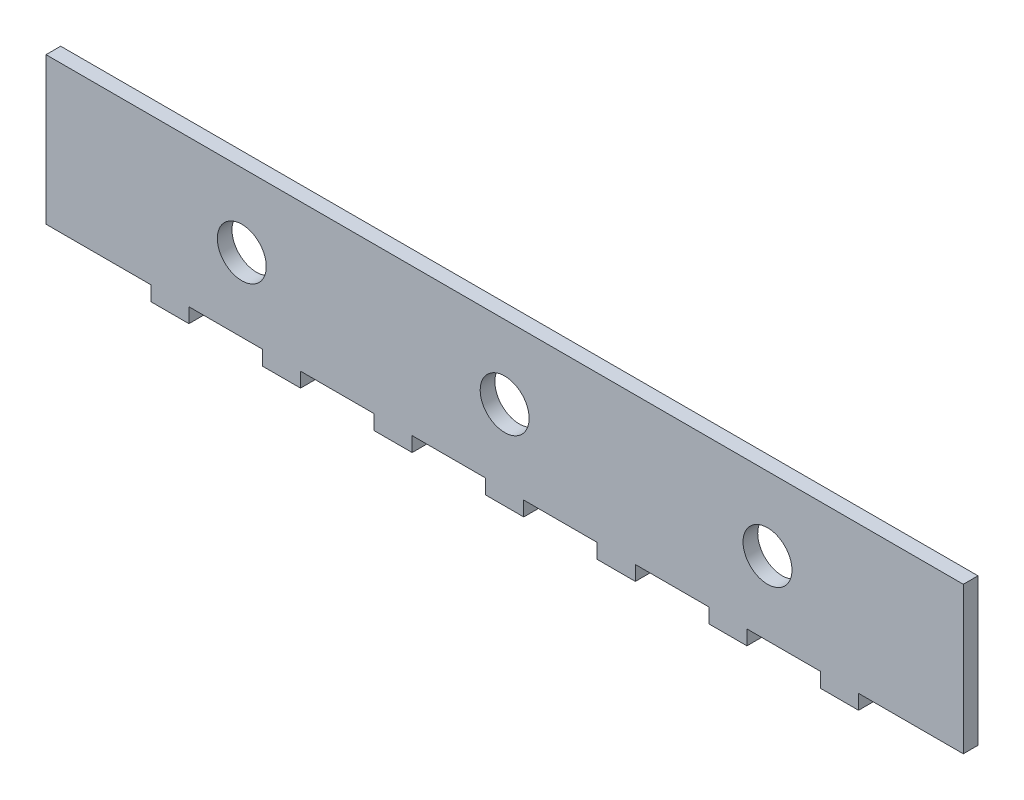
ISO-10303-21;
HEADER;
FILE_DESCRIPTION(('STEP AP214'),'2;1');
FILE_NAME('part.step','',(''),(''),'','','');
FILE_SCHEMA(('AUTOMOTIVE_DESIGN { 1 0 10303 214 1 1 1 1 }'));
ENDSEC;
DATA;
#1=APPLICATION_CONTEXT('core data for automotive mechanical design processes');
#2=APPLICATION_PROTOCOL_DEFINITION('international standard','automotive_design',2000,#1);
#3=PRODUCT_CONTEXT('',#1,'mechanical');
#4=PRODUCT('Part','Part','',(#3));
#5=PRODUCT_RELATED_PRODUCT_CATEGORY('part','',(#4));
#6=PRODUCT_DEFINITION_FORMATION('','',#4);
#7=PRODUCT_DEFINITION_CONTEXT('part definition',#1,'design');
#8=PRODUCT_DEFINITION('design','',#6,#7);
#9=PRODUCT_DEFINITION_SHAPE('','',#8);
#10=(LENGTH_UNIT() NAMED_UNIT(*) SI_UNIT(.MILLI.,.METRE.));
#11=(NAMED_UNIT(*) PLANE_ANGLE_UNIT() SI_UNIT($,.RADIAN.));
#12=(NAMED_UNIT(*) SI_UNIT($,.STERADIAN.) SOLID_ANGLE_UNIT());
#13=UNCERTAINTY_MEASURE_WITH_UNIT(LENGTH_MEASURE(1.E-05),#10,'distance_accuracy_value','');
#14=(GEOMETRIC_REPRESENTATION_CONTEXT(3) GLOBAL_UNCERTAINTY_ASSIGNED_CONTEXT((#13)) GLOBAL_UNIT_ASSIGNED_CONTEXT((#10,
#11,#12)) REPRESENTATION_CONTEXT('',''));
#15=CARTESIAN_POINT('',(0.,0.,0.));
#16=DIRECTION('',(0.,0.,1.));
#17=DIRECTION('',(1.,0.,0.));
#18=AXIS2_PLACEMENT_3D('',#15,#16,#17);
#19=CARTESIAN_POINT('',(-93.7,-15.,3.));
#20=DIRECTION('',(0.,1.,0.));
#21=DIRECTION('',(0.,0.,1.));
#22=AXIS2_PLACEMENT_3D('',#19,#20,#21);
#23=PLANE('',#22);
#24=DIRECTION('',(0.,0.,-1.));
#25=VECTOR('',#24,1.);
#26=CARTESIAN_POINT('',(64.5,-15.,3.));
#27=LINE('',#26,#25);
#28=CARTESIAN_POINT('',(64.5,-15.,3.));
#29=VERTEX_POINT('',#28);
#30=CARTESIAN_POINT('',(64.5,-15.,0.));
#31=VERTEX_POINT('',#30);
#32=EDGE_CURVE('E58',#29,#31,#27,.T.);
#33=ORIENTED_EDGE('',*,*,#32,.F.);
#34=DIRECTION('',(1.,0.,0.));
#35=VECTOR('',#34,1.);
#36=CARTESIAN_POINT('',(-93.7,-15.,3.));
#37=LINE('',#36,#35);
#38=CARTESIAN_POINT('',(49.5,-15.,3.));
#39=VERTEX_POINT('',#38);
#40=EDGE_CURVE('E483',#39,#29,#37,.T.);
#41=ORIENTED_EDGE('',*,*,#40,.F.);
#42=DIRECTION('',(0.,0.,1.));
#43=VECTOR('',#42,1.);
#44=CARTESIAN_POINT('',(49.5,-15.,3.));
#45=LINE('',#44,#43);
#46=CARTESIAN_POINT('',(49.5,-15.,0.));
#47=VERTEX_POINT('',#46);
#48=EDGE_CURVE('E271',#47,#39,#45,.T.);
#49=ORIENTED_EDGE('',*,*,#48,.F.);
#50=DIRECTION('',(1.,0.,0.));
#51=VECTOR('',#50,1.);
#52=CARTESIAN_POINT('',(-93.7,-15.,0.));
#53=LINE('',#52,#51);
#54=EDGE_CURVE('E521',#47,#31,#53,.T.);
#55=ORIENTED_EDGE('',*,*,#54,.T.);
#56=EDGE_LOOP('',(#33,#41,#49,#55));
#57=FACE_BOUND('',#56,.T.);
#58=ADVANCED_FACE('F35',(#57),#23,.F.);
#59=DIRECTION('',(0.,0.,1.));
#60=VECTOR('',#59,1.);
#61=CARTESIAN_POINT('',(72.3,-15.,3.));
#62=LINE('',#61,#60);
#63=CARTESIAN_POINT('',(72.3,-15.,0.));
#64=VERTEX_POINT('',#63);
#65=CARTESIAN_POINT('',(72.3,-15.,3.));
#66=VERTEX_POINT('',#65);
#67=EDGE_CURVE('E265',#64,#66,#62,.T.);
#68=ORIENTED_EDGE('',*,*,#67,.F.);
#69=CARTESIAN_POINT('',(93.7,-15.,0.));
#70=VERTEX_POINT('',#69);
#71=EDGE_CURVE('E451',#64,#70,#53,.T.);
#72=ORIENTED_EDGE('',*,*,#71,.T.);
#73=DIRECTION('',(0.,0.,-1.));
#74=VECTOR('',#73,1.);
#75=CARTESIAN_POINT('',(93.7,-15.,3.));
#76=LINE('',#75,#74);
#77=CARTESIAN_POINT('',(93.7,-15.,3.));
#78=VERTEX_POINT('',#77);
#79=EDGE_CURVE('E43',#78,#70,#76,.T.);
#80=ORIENTED_EDGE('',*,*,#79,.F.);
#81=EDGE_CURVE('E50',#66,#78,#37,.T.);
#82=ORIENTED_EDGE('',*,*,#81,.F.);
#83=EDGE_LOOP('',(#68,#72,#80,#82));
#84=FACE_BOUND('',#83,.T.);
#85=ADVANCED_FACE('F550',(#84),#23,.F.);
#86=DIRECTION('',(0.,0.,-1.));
#87=VECTOR('',#86,1.);
#88=CARTESIAN_POINT('',(41.7,-15.,3.));
#89=LINE('',#88,#87);
#90=CARTESIAN_POINT('',(41.7,-15.,3.));
#91=VERTEX_POINT('',#90);
#92=CARTESIAN_POINT('',(41.7,-15.,0.));
#93=VERTEX_POINT('',#92);
#94=EDGE_CURVE('E268',#91,#93,#89,.T.);
#95=ORIENTED_EDGE('',*,*,#94,.F.);
#96=CARTESIAN_POINT('',(26.7,-15.,3.));
#97=VERTEX_POINT('',#96);
#98=EDGE_CURVE('E484',#97,#91,#37,.T.);
#99=ORIENTED_EDGE('',*,*,#98,.F.);
#100=DIRECTION('',(0.,0.,1.));
#101=VECTOR('',#100,1.);
#102=CARTESIAN_POINT('',(26.7,-15.,3.));
#103=LINE('',#102,#101);
#104=CARTESIAN_POINT('',(26.7,-15.,0.));
#105=VERTEX_POINT('',#104);
#106=EDGE_CURVE('E305',#105,#97,#103,.T.);
#107=ORIENTED_EDGE('',*,*,#106,.F.);
#108=EDGE_CURVE('E519',#105,#93,#53,.T.);
#109=ORIENTED_EDGE('',*,*,#108,.T.);
#110=EDGE_LOOP('',(#95,#99,#107,#109));
#111=FACE_BOUND('',#110,.T.);
#112=ADVANCED_FACE('F555',(#111),#23,.F.);
#113=DIRECTION('',(0.,0.,-1.));
#114=VECTOR('',#113,1.);
#115=CARTESIAN_POINT('',(18.9,-15.,3.));
#116=LINE('',#115,#114);
#117=CARTESIAN_POINT('',(18.9,-15.,3.));
#118=VERTEX_POINT('',#117);
#119=CARTESIAN_POINT('',(18.9,-15.,0.));
#120=VERTEX_POINT('',#119);
#121=EDGE_CURVE('E300',#118,#120,#116,.T.);
#122=ORIENTED_EDGE('',*,*,#121,.F.);
#123=CARTESIAN_POINT('',(3.9,-15.,3.));
#124=VERTEX_POINT('',#123);
#125=EDGE_CURVE('E444',#124,#118,#37,.T.);
#126=ORIENTED_EDGE('',*,*,#125,.F.);
#127=DIRECTION('',(0.,0.,1.));
#128=VECTOR('',#127,1.);
#129=CARTESIAN_POINT('',(3.9,-15.,3.));
#130=LINE('',#129,#128);
#131=CARTESIAN_POINT('',(3.9,-15.,0.));
#132=VERTEX_POINT('',#131);
#133=EDGE_CURVE('E413',#132,#124,#130,.T.);
#134=ORIENTED_EDGE('',*,*,#133,.F.);
#135=EDGE_CURVE('E456',#132,#120,#53,.T.);
#136=ORIENTED_EDGE('',*,*,#135,.T.);
#137=EDGE_LOOP('',(#122,#126,#134,#136));
#138=FACE_BOUND('',#137,.T.);
#139=ADVANCED_FACE('F517',(#138),#23,.F.);
#140=DIRECTION('',(0.,0.,-1.));
#141=VECTOR('',#140,1.);
#142=CARTESIAN_POINT('',(-72.3,-15.,3.));
#143=LINE('',#142,#141);
#144=CARTESIAN_POINT('',(-72.3,-15.,3.));
#145=VERTEX_POINT('',#144);
#146=CARTESIAN_POINT('',(-72.3,-15.,0.));
#147=VERTEX_POINT('',#146);
#148=EDGE_CURVE('E327',#145,#147,#143,.T.);
#149=ORIENTED_EDGE('',*,*,#148,.F.);
#150=CARTESIAN_POINT('',(-93.7,-15.,3.));
#151=VERTEX_POINT('',#150);
#152=EDGE_CURVE('E439',#151,#145,#37,.T.);
#153=ORIENTED_EDGE('',*,*,#152,.F.);
#154=DIRECTION('',(0.,0.,-1.));
#155=VECTOR('',#154,1.);
#156=CARTESIAN_POINT('',(-93.7,-15.,3.));
#157=LINE('',#156,#155);
#158=CARTESIAN_POINT('',(-93.7,-15.,0.));
#159=VERTEX_POINT('',#158);
#160=EDGE_CURVE('E11',#151,#159,#157,.T.);
#161=ORIENTED_EDGE('',*,*,#160,.T.);
#162=EDGE_CURVE('E452',#159,#147,#53,.T.);
#163=ORIENTED_EDGE('',*,*,#162,.T.);
#164=EDGE_LOOP('',(#149,#153,#161,#163));
#165=FACE_BOUND('',#164,.T.);
#166=ADVANCED_FACE('F551',(#165),#23,.F.);
#167=DIRECTION('',(0.,0.,1.));
#168=VECTOR('',#167,1.);
#169=CARTESIAN_POINT('',(-64.5,-15.,3.));
#170=LINE('',#169,#168);
#171=CARTESIAN_POINT('',(-64.5,-15.,0.));
#172=VERTEX_POINT('',#171);
#173=CARTESIAN_POINT('',(-64.5,-15.,3.));
#174=VERTEX_POINT('',#173);
#175=EDGE_CURVE('E332',#172,#174,#170,.T.);
#176=ORIENTED_EDGE('',*,*,#175,.F.);
#177=CARTESIAN_POINT('',(-49.5,-15.,0.));
#178=VERTEX_POINT('',#177);
#179=EDGE_CURVE('E455',#172,#178,#53,.T.);
#180=ORIENTED_EDGE('',*,*,#179,.T.);
#181=DIRECTION('',(0.,0.,-1.));
#182=VECTOR('',#181,1.);
#183=CARTESIAN_POINT('',(-49.5,-15.,3.));
#184=LINE('',#183,#182);
#185=CARTESIAN_POINT('',(-49.5,-15.,3.));
#186=VERTEX_POINT('',#185);
#187=EDGE_CURVE('E354',#186,#178,#184,.T.);
#188=ORIENTED_EDGE('',*,*,#187,.F.);
#189=EDGE_CURVE('E443',#174,#186,#37,.T.);
#190=ORIENTED_EDGE('',*,*,#189,.F.);
#191=EDGE_LOOP('',(#176,#180,#188,#190));
#192=FACE_BOUND('',#191,.T.);
#193=ADVANCED_FACE('F558',(#192),#23,.F.);
#194=DIRECTION('',(0.,0.,1.));
#195=VECTOR('',#194,1.);
#196=CARTESIAN_POINT('',(-41.7,-15.,3.));
#197=LINE('',#196,#195);
#198=CARTESIAN_POINT('',(-41.7,-15.,0.));
#199=VERTEX_POINT('',#198);
#200=CARTESIAN_POINT('',(-41.7,-15.,3.));
#201=VERTEX_POINT('',#200);
#202=EDGE_CURVE('E359',#199,#201,#197,.T.);
#203=ORIENTED_EDGE('',*,*,#202,.F.);
#204=CARTESIAN_POINT('',(-26.7,-15.,0.));
#205=VERTEX_POINT('',#204);
#206=EDGE_CURVE('E520',#199,#205,#53,.T.);
#207=ORIENTED_EDGE('',*,*,#206,.T.);
#208=DIRECTION('',(0.,0.,-1.));
#209=VECTOR('',#208,1.);
#210=CARTESIAN_POINT('',(-26.7,-15.,3.));
#211=LINE('',#210,#209);
#212=CARTESIAN_POINT('',(-26.7,-15.,3.));
#213=VERTEX_POINT('',#212);
#214=EDGE_CURVE('E381',#213,#205,#211,.T.);
#215=ORIENTED_EDGE('',*,*,#214,.F.);
#216=EDGE_CURVE('E489',#201,#213,#37,.T.);
#217=ORIENTED_EDGE('',*,*,#216,.F.);
#218=EDGE_LOOP('',(#203,#207,#215,#217));
#219=FACE_BOUND('',#218,.T.);
#220=ADVANCED_FACE('F528',(#219),#23,.F.);
#221=DIRECTION('',(0.,0.,1.));
#222=VECTOR('',#221,1.);
#223=CARTESIAN_POINT('',(-18.9,-15.,3.));
#224=LINE('',#223,#222);
#225=CARTESIAN_POINT('',(-18.9,-15.,0.));
#226=VERTEX_POINT('',#225);
#227=CARTESIAN_POINT('',(-18.9,-15.,3.));
#228=VERTEX_POINT('',#227);
#229=EDGE_CURVE('E386',#226,#228,#224,.T.);
#230=ORIENTED_EDGE('',*,*,#229,.F.);
#231=CARTESIAN_POINT('',(-3.9,-15.,0.));
#232=VERTEX_POINT('',#231);
#233=EDGE_CURVE('E503',#226,#232,#53,.T.);
#234=ORIENTED_EDGE('',*,*,#233,.T.);
#235=DIRECTION('',(0.,0.,-1.));
#236=VECTOR('',#235,1.);
#237=CARTESIAN_POINT('',(-3.9,-15.,3.));
#238=LINE('',#237,#236);
#239=CARTESIAN_POINT('',(-3.9,-15.,3.));
#240=VERTEX_POINT('',#239);
#241=EDGE_CURVE('E408',#240,#232,#238,.T.);
#242=ORIENTED_EDGE('',*,*,#241,.F.);
#243=EDGE_CURVE('E488',#228,#240,#37,.T.);
#244=ORIENTED_EDGE('',*,*,#243,.F.);
#245=EDGE_LOOP('',(#230,#234,#242,#244));
#246=FACE_BOUND('',#245,.T.);
#247=ADVANCED_FACE('F502',(#246),#23,.F.);
#248=CARTESIAN_POINT('',(-93.7,15.,3.));
#249=DIRECTION('',(1.,0.,0.));
#250=DIRECTION('',(0.,1.,0.));
#251=AXIS2_PLACEMENT_3D('',#248,#249,#250);
#252=PLANE('',#251);
#253=DIRECTION('',(0.,-1.,0.));
#254=VECTOR('',#253,1.);
#255=CARTESIAN_POINT('',(-93.7,15.,0.));
#256=LINE('',#255,#254);
#257=CARTESIAN_POINT('',(-93.7,15.,0.));
#258=VERTEX_POINT('',#257);
#259=EDGE_CURVE('E434',#258,#159,#256,.T.);
#260=ORIENTED_EDGE('',*,*,#259,.T.);
#261=ORIENTED_EDGE('',*,*,#160,.F.);
#262=DIRECTION('',(0.,-1.,0.));
#263=VECTOR('',#262,1.);
#264=CARTESIAN_POINT('',(-93.7,15.,3.));
#265=LINE('',#264,#263);
#266=CARTESIAN_POINT('',(-93.7,15.,3.));
#267=VERTEX_POINT('',#266);
#268=EDGE_CURVE('E435',#267,#151,#265,.T.);
#269=ORIENTED_EDGE('',*,*,#268,.F.);
#270=DIRECTION('',(0.,0.,-1.));
#271=VECTOR('',#270,1.);
#272=CARTESIAN_POINT('',(-93.7,15.,3.));
#273=LINE('',#272,#271);
#274=EDGE_CURVE('E448',#267,#258,#273,.T.);
#275=ORIENTED_EDGE('',*,*,#274,.T.);
#276=EDGE_LOOP('',(#260,#261,#269,#275));
#277=FACE_BOUND('',#276,.T.);
#278=ADVANCED_FACE('F37',(#277),#252,.F.);
#279=CARTESIAN_POINT('',(93.7,15.,3.));
#280=DIRECTION('',(-1.,0.,0.));
#281=DIRECTION('',(0.,-1.,0.));
#282=AXIS2_PLACEMENT_3D('',#279,#280,#281);
#283=PLANE('',#282);
#284=DIRECTION('',(0.,1.,0.));
#285=VECTOR('',#284,1.);
#286=CARTESIAN_POINT('',(93.7,15.,0.));
#287=LINE('',#286,#285);
#288=CARTESIAN_POINT('',(93.7,15.,0.));
#289=VERTEX_POINT('',#288);
#290=EDGE_CURVE('E454',#70,#289,#287,.T.);
#291=ORIENTED_EDGE('',*,*,#290,.T.);
#292=DIRECTION('',(0.,0.,-1.));
#293=VECTOR('',#292,1.);
#294=CARTESIAN_POINT('',(93.7,15.,3.));
#295=LINE('',#294,#293);
#296=CARTESIAN_POINT('',(93.7,15.,3.));
#297=VERTEX_POINT('',#296);
#298=EDGE_CURVE('E461',#297,#289,#295,.T.);
#299=ORIENTED_EDGE('',*,*,#298,.F.);
#300=DIRECTION('',(0.,1.,0.));
#301=VECTOR('',#300,1.);
#302=CARTESIAN_POINT('',(93.7,15.,3.));
#303=LINE('',#302,#301);
#304=EDGE_CURVE('E442',#78,#297,#303,.T.);
#305=ORIENTED_EDGE('',*,*,#304,.F.);
#306=ORIENTED_EDGE('',*,*,#79,.T.);
#307=EDGE_LOOP('',(#291,#299,#305,#306));
#308=FACE_BOUND('',#307,.T.);
#309=ADVANCED_FACE('F467',(#308),#283,.F.);
#310=CARTESIAN_POINT('',(-93.7,15.,3.));
#311=DIRECTION('',(0.,-1.,0.));
#312=DIRECTION('',(0.,0.,-1.));
#313=AXIS2_PLACEMENT_3D('',#310,#311,#312);
#314=PLANE('',#313);
#315=DIRECTION('',(-1.,0.,0.));
#316=VECTOR('',#315,1.);
#317=CARTESIAN_POINT('',(-93.7,15.,0.));
#318=LINE('',#317,#316);
#319=EDGE_CURVE('E438',#289,#258,#318,.T.);
#320=ORIENTED_EDGE('',*,*,#319,.T.);
#321=ORIENTED_EDGE('',*,*,#274,.F.);
#322=DIRECTION('',(-1.,0.,0.));
#323=VECTOR('',#322,1.);
#324=CARTESIAN_POINT('',(-93.7,15.,3.));
#325=LINE('',#324,#323);
#326=EDGE_CURVE('E446',#297,#267,#325,.T.);
#327=ORIENTED_EDGE('',*,*,#326,.F.);
#328=ORIENTED_EDGE('',*,*,#298,.T.);
#329=EDGE_LOOP('',(#320,#321,#327,#328));
#330=FACE_BOUND('',#329,.T.);
#331=ADVANCED_FACE('F473',(#330),#314,.F.);
#332=CARTESIAN_POINT('',(0.,0.,3.));
#333=DIRECTION('',(0.,0.,1.));
#334=DIRECTION('',(1.,0.,0.));
#335=AXIS2_PLACEMENT_3D('',#332,#333,#334);
#336=PLANE('',#335);
#337=CARTESIAN_POINT('',(-53.7,0.,3.));
#338=DIRECTION('',(0.,0.,-1.));
#339=DIRECTION('',(-1.,0.,0.));
#340=AXIS2_PLACEMENT_3D('',#337,#338,#339);
#341=CIRCLE('',#340,5.);
#342=CARTESIAN_POINT('',(-58.7,0.,3.));
#343=VERTEX_POINT('',#342);
#344=EDGE_CURVE('E671',#343,#343,#341,.T.);
#345=ORIENTED_EDGE('',*,*,#344,.T.);
#346=EDGE_LOOP('',(#345));
#347=FACE_BOUND('',#346,.T.);
#348=CARTESIAN_POINT('',(53.7,0.,3.));
#349=DIRECTION('',(0.,0.,-1.));
#350=DIRECTION('',(-1.,0.,0.));
#351=AXIS2_PLACEMENT_3D('',#348,#349,#350);
#352=CIRCLE('',#351,5.);
#353=CARTESIAN_POINT('',(48.7,0.,3.));
#354=VERTEX_POINT('',#353);
#355=EDGE_CURVE('E675',#354,#354,#352,.T.);
#356=ORIENTED_EDGE('',*,*,#355,.T.);
#357=EDGE_LOOP('',(#356));
#358=FACE_BOUND('',#357,.T.);
#359=CARTESIAN_POINT('',(0.,0.,3.));
#360=DIRECTION('',(0.,0.,-1.));
#361=DIRECTION('',(-1.,0.,0.));
#362=AXIS2_PLACEMENT_3D('',#359,#360,#361);
#363=CIRCLE('',#362,5.);
#364=CARTESIAN_POINT('',(-5.,0.,3.));
#365=VERTEX_POINT('',#364);
#366=EDGE_CURVE('E678',#365,#365,#363,.T.);
#367=ORIENTED_EDGE('',*,*,#366,.T.);
#368=EDGE_LOOP('',(#367));
#369=FACE_BOUND('',#368,.T.);
#370=DIRECTION('',(0.,1.,0.));
#371=VECTOR('',#370,1.);
#372=CARTESIAN_POINT('',(3.9,-18.,3.));
#373=LINE('',#372,#371);
#374=CARTESIAN_POINT('',(3.9,-18.,3.));
#375=VERTEX_POINT('',#374);
#376=EDGE_CURVE('E426',#375,#124,#373,.T.);
#377=ORIENTED_EDGE('',*,*,#376,.T.);
#378=ORIENTED_EDGE('',*,*,#125,.T.);
#379=DIRECTION('',(0.,1.,0.));
#380=VECTOR('',#379,1.);
#381=CARTESIAN_POINT('',(18.9,-18.,3.));
#382=LINE('',#381,#380);
#383=CARTESIAN_POINT('',(18.9,-18.,3.));
#384=VERTEX_POINT('',#383);
#385=EDGE_CURVE('E311',#384,#118,#382,.T.);
#386=ORIENTED_EDGE('',*,*,#385,.F.);
#387=DIRECTION('',(-1.,0.,0.));
#388=VECTOR('',#387,1.);
#389=CARTESIAN_POINT('',(18.9,-18.,3.));
#390=LINE('',#389,#388);
#391=CARTESIAN_POINT('',(26.7,-18.,3.));
#392=VERTEX_POINT('',#391);
#393=EDGE_CURVE('E309',#392,#384,#390,.T.);
#394=ORIENTED_EDGE('',*,*,#393,.F.);
#395=DIRECTION('',(0.,1.,0.));
#396=VECTOR('',#395,1.);
#397=CARTESIAN_POINT('',(26.7,-18.,3.));
#398=LINE('',#397,#396);
#399=EDGE_CURVE('E318',#392,#97,#398,.T.);
#400=ORIENTED_EDGE('',*,*,#399,.T.);
#401=ORIENTED_EDGE('',*,*,#98,.T.);
#402=DIRECTION('',(0.,1.,0.));
#403=VECTOR('',#402,1.);
#404=CARTESIAN_POINT('',(41.7,-18.,3.));
#405=LINE('',#404,#403);
#406=CARTESIAN_POINT('',(41.7,-18.,3.));
#407=VERTEX_POINT('',#406);
#408=EDGE_CURVE('E285',#407,#91,#405,.T.);
#409=ORIENTED_EDGE('',*,*,#408,.F.);
#410=DIRECTION('',(-1.,0.,0.));
#411=VECTOR('',#410,1.);
#412=CARTESIAN_POINT('',(41.7,-18.,3.));
#413=LINE('',#412,#411);
#414=CARTESIAN_POINT('',(49.5,-18.,3.));
#415=VERTEX_POINT('',#414);
#416=EDGE_CURVE('E284',#415,#407,#413,.T.);
#417=ORIENTED_EDGE('',*,*,#416,.F.);
#418=DIRECTION('',(0.,1.,0.));
#419=VECTOR('',#418,1.);
#420=CARTESIAN_POINT('',(49.5,-18.,3.));
#421=LINE('',#420,#419);
#422=EDGE_CURVE('E291',#415,#39,#421,.T.);
#423=ORIENTED_EDGE('',*,*,#422,.T.);
#424=ORIENTED_EDGE('',*,*,#40,.T.);
#425=DIRECTION('',(0.,1.,0.));
#426=VECTOR('',#425,1.);
#427=CARTESIAN_POINT('',(64.5,-18.,3.));
#428=LINE('',#427,#426);
#429=CARTESIAN_POINT('',(64.5,-18.,3.));
#430=VERTEX_POINT('',#429);
#431=EDGE_CURVE('E690',#430,#29,#428,.T.);
#432=ORIENTED_EDGE('',*,*,#431,.F.);
#433=DIRECTION('',(-1.,0.,0.));
#434=VECTOR('',#433,1.);
#435=CARTESIAN_POINT('',(64.5,-18.,3.));
#436=LINE('',#435,#434);
#437=CARTESIAN_POINT('',(72.3,-18.,3.));
#438=VERTEX_POINT('',#437);
#439=EDGE_CURVE('E261',#438,#430,#436,.T.);
#440=ORIENTED_EDGE('',*,*,#439,.F.);
#441=DIRECTION('',(0.,1.,0.));
#442=VECTOR('',#441,1.);
#443=CARTESIAN_POINT('',(72.3,-18.,3.));
#444=LINE('',#443,#442);
#445=EDGE_CURVE('E273',#438,#66,#444,.T.);
#446=ORIENTED_EDGE('',*,*,#445,.T.);
#447=ORIENTED_EDGE('',*,*,#81,.T.);
#448=ORIENTED_EDGE('',*,*,#304,.T.);
#449=ORIENTED_EDGE('',*,*,#326,.T.);
#450=ORIENTED_EDGE('',*,*,#268,.T.);
#451=ORIENTED_EDGE('',*,*,#152,.T.);
#452=DIRECTION('',(0.,1.,0.));
#453=VECTOR('',#452,1.);
#454=CARTESIAN_POINT('',(-72.3,-18.,3.));
#455=LINE('',#454,#453);
#456=CARTESIAN_POINT('',(-72.3,-18.,3.));
#457=VERTEX_POINT('',#456);
#458=EDGE_CURVE('E338',#457,#145,#455,.T.);
#459=ORIENTED_EDGE('',*,*,#458,.F.);
#460=DIRECTION('',(-1.,0.,0.));
#461=VECTOR('',#460,1.);
#462=CARTESIAN_POINT('',(-72.3,-18.,3.));
#463=LINE('',#462,#461);
#464=CARTESIAN_POINT('',(-64.5,-18.,3.));
#465=VERTEX_POINT('',#464);
#466=EDGE_CURVE('E336',#465,#457,#463,.T.);
#467=ORIENTED_EDGE('',*,*,#466,.F.);
#468=DIRECTION('',(0.,1.,0.));
#469=VECTOR('',#468,1.);
#470=CARTESIAN_POINT('',(-64.5,-18.,3.));
#471=LINE('',#470,#469);
#472=EDGE_CURVE('E345',#465,#174,#471,.T.);
#473=ORIENTED_EDGE('',*,*,#472,.T.);
#474=ORIENTED_EDGE('',*,*,#189,.T.);
#475=DIRECTION('',(0.,1.,0.));
#476=VECTOR('',#475,1.);
#477=CARTESIAN_POINT('',(-49.5,-18.,3.));
#478=LINE('',#477,#476);
#479=CARTESIAN_POINT('',(-49.5,-18.,3.));
#480=VERTEX_POINT('',#479);
#481=EDGE_CURVE('E365',#480,#186,#478,.T.);
#482=ORIENTED_EDGE('',*,*,#481,.F.);
#483=DIRECTION('',(-1.,0.,0.));
#484=VECTOR('',#483,1.);
#485=CARTESIAN_POINT('',(-49.5,-18.,3.));
#486=LINE('',#485,#484);
#487=CARTESIAN_POINT('',(-41.7,-18.,3.));
#488=VERTEX_POINT('',#487);
#489=EDGE_CURVE('E363',#488,#480,#486,.T.);
#490=ORIENTED_EDGE('',*,*,#489,.F.);
#491=DIRECTION('',(0.,1.,0.));
#492=VECTOR('',#491,1.);
#493=CARTESIAN_POINT('',(-41.7,-18.,3.));
#494=LINE('',#493,#492);
#495=EDGE_CURVE('E372',#488,#201,#494,.T.);
#496=ORIENTED_EDGE('',*,*,#495,.T.);
#497=ORIENTED_EDGE('',*,*,#216,.T.);
#498=DIRECTION('',(0.,1.,0.));
#499=VECTOR('',#498,1.);
#500=CARTESIAN_POINT('',(-26.7,-18.,3.));
#501=LINE('',#500,#499);
#502=CARTESIAN_POINT('',(-26.7,-18.,3.));
#503=VERTEX_POINT('',#502);
#504=EDGE_CURVE('E392',#503,#213,#501,.T.);
#505=ORIENTED_EDGE('',*,*,#504,.F.);
#506=DIRECTION('',(-1.,0.,0.));
#507=VECTOR('',#506,1.);
#508=CARTESIAN_POINT('',(-26.7,-18.,3.));
#509=LINE('',#508,#507);
#510=CARTESIAN_POINT('',(-18.9,-18.,3.));
#511=VERTEX_POINT('',#510);
#512=EDGE_CURVE('E390',#511,#503,#509,.T.);
#513=ORIENTED_EDGE('',*,*,#512,.F.);
#514=DIRECTION('',(0.,1.,0.));
#515=VECTOR('',#514,1.);
#516=CARTESIAN_POINT('',(-18.9,-18.,3.));
#517=LINE('',#516,#515);
#518=EDGE_CURVE('E399',#511,#228,#517,.T.);
#519=ORIENTED_EDGE('',*,*,#518,.T.);
#520=ORIENTED_EDGE('',*,*,#243,.T.);
#521=DIRECTION('',(0.,1.,0.));
#522=VECTOR('',#521,1.);
#523=CARTESIAN_POINT('',(-3.9,-18.,3.));
#524=LINE('',#523,#522);
#525=CARTESIAN_POINT('',(-3.9,-18.,3.));
#526=VERTEX_POINT('',#525);
#527=EDGE_CURVE('E419',#526,#240,#524,.T.);
#528=ORIENTED_EDGE('',*,*,#527,.F.);
#529=DIRECTION('',(-1.,0.,0.));
#530=VECTOR('',#529,1.);
#531=CARTESIAN_POINT('',(-3.9,-18.,3.));
#532=LINE('',#531,#530);
#533=EDGE_CURVE('E417',#375,#526,#532,.T.);
#534=ORIENTED_EDGE('',*,*,#533,.F.);
#535=EDGE_LOOP('',(#377,#378,#386,#394,#400,#401,#409,#417,#423,#424,#432,#440,#446,#447,#448,
#449,#450,#451,#459,#467,#473,#474,#482,#490,#496,#497,#505,#513,#519,#520,#528,#534));
#536=FACE_BOUND('',#535,.T.);
#537=ADVANCED_FACE('F479',(#347,#358,#369,#536),#336,.T.);
#538=CARTESIAN_POINT('',(0.,0.,0.));
#539=DIRECTION('',(0.,0.,1.));
#540=DIRECTION('',(1.,0.,0.));
#541=AXIS2_PLACEMENT_3D('',#538,#539,#540);
#542=PLANE('',#541);
#543=CARTESIAN_POINT('',(-53.7,0.,0.));
#544=DIRECTION('',(0.,0.,-1.));
#545=DIRECTION('',(-1.,0.,0.));
#546=AXIS2_PLACEMENT_3D('',#543,#544,#545);
#547=CIRCLE('',#546,5.);
#548=CARTESIAN_POINT('',(-58.7,0.,0.));
#549=VERTEX_POINT('',#548);
#550=EDGE_CURVE('E686',#549,#549,#547,.T.);
#551=ORIENTED_EDGE('',*,*,#550,.F.);
#552=EDGE_LOOP('',(#551));
#553=FACE_BOUND('',#552,.T.);
#554=CARTESIAN_POINT('',(53.7,0.,0.));
#555=DIRECTION('',(0.,0.,-1.));
#556=DIRECTION('',(-1.,0.,0.));
#557=AXIS2_PLACEMENT_3D('',#554,#555,#556);
#558=CIRCLE('',#557,5.);
#559=CARTESIAN_POINT('',(48.7,0.,0.));
#560=VERTEX_POINT('',#559);
#561=EDGE_CURVE('E858',#560,#560,#558,.T.);
#562=ORIENTED_EDGE('',*,*,#561,.F.);
#563=EDGE_LOOP('',(#562));
#564=FACE_BOUND('',#563,.T.);
#565=CARTESIAN_POINT('',(0.,0.,0.));
#566=DIRECTION('',(0.,0.,-1.));
#567=DIRECTION('',(-1.,0.,0.));
#568=AXIS2_PLACEMENT_3D('',#565,#566,#567);
#569=CIRCLE('',#568,5.);
#570=CARTESIAN_POINT('',(-5.,0.,0.));
#571=VERTEX_POINT('',#570);
#572=EDGE_CURVE('E680',#571,#571,#569,.T.);
#573=ORIENTED_EDGE('',*,*,#572,.F.);
#574=EDGE_LOOP('',(#573));
#575=FACE_BOUND('',#574,.T.);
#576=DIRECTION('',(0.,1.,0.));
#577=VECTOR('',#576,1.);
#578=CARTESIAN_POINT('',(-3.9,-18.,0.));
#579=LINE('',#578,#577);
#580=CARTESIAN_POINT('',(-3.9,-18.,0.));
#581=VERTEX_POINT('',#580);
#582=EDGE_CURVE('E432',#581,#232,#579,.T.);
#583=ORIENTED_EDGE('',*,*,#582,.T.);
#584=ORIENTED_EDGE('',*,*,#233,.F.);
#585=DIRECTION('',(0.,1.,0.));
#586=VECTOR('',#585,1.);
#587=CARTESIAN_POINT('',(-18.9,-18.,0.));
#588=LINE('',#587,#586);
#589=CARTESIAN_POINT('',(-18.9,-18.,0.));
#590=VERTEX_POINT('',#589);
#591=EDGE_CURVE('E402',#590,#226,#588,.T.);
#592=ORIENTED_EDGE('',*,*,#591,.F.);
#593=DIRECTION('',(1.,0.,0.));
#594=VECTOR('',#593,1.);
#595=CARTESIAN_POINT('',(-26.7,-18.,0.));
#596=LINE('',#595,#594);
#597=CARTESIAN_POINT('',(-26.7,-18.,0.));
#598=VERTEX_POINT('',#597);
#599=EDGE_CURVE('E385',#598,#590,#596,.T.);
#600=ORIENTED_EDGE('',*,*,#599,.F.);
#601=DIRECTION('',(0.,1.,0.));
#602=VECTOR('',#601,1.);
#603=CARTESIAN_POINT('',(-26.7,-18.,0.));
#604=LINE('',#603,#602);
#605=EDGE_CURVE('E405',#598,#205,#604,.T.);
#606=ORIENTED_EDGE('',*,*,#605,.T.);
#607=ORIENTED_EDGE('',*,*,#206,.F.);
#608=DIRECTION('',(0.,1.,0.));
#609=VECTOR('',#608,1.);
#610=CARTESIAN_POINT('',(-41.7,-18.,0.));
#611=LINE('',#610,#609);
#612=CARTESIAN_POINT('',(-41.7,-18.,0.));
#613=VERTEX_POINT('',#612);
#614=EDGE_CURVE('E375',#613,#199,#611,.T.);
#615=ORIENTED_EDGE('',*,*,#614,.F.);
#616=DIRECTION('',(1.,0.,0.));
#617=VECTOR('',#616,1.);
#618=CARTESIAN_POINT('',(-49.5,-18.,0.));
#619=LINE('',#618,#617);
#620=CARTESIAN_POINT('',(-49.5,-18.,0.));
#621=VERTEX_POINT('',#620);
#622=EDGE_CURVE('E358',#621,#613,#619,.T.);
#623=ORIENTED_EDGE('',*,*,#622,.F.);
#624=DIRECTION('',(0.,1.,0.));
#625=VECTOR('',#624,1.);
#626=CARTESIAN_POINT('',(-49.5,-18.,0.));
#627=LINE('',#626,#625);
#628=EDGE_CURVE('E378',#621,#178,#627,.T.);
#629=ORIENTED_EDGE('',*,*,#628,.T.);
#630=ORIENTED_EDGE('',*,*,#179,.F.);
#631=DIRECTION('',(0.,1.,0.));
#632=VECTOR('',#631,1.);
#633=CARTESIAN_POINT('',(-64.5,-18.,0.));
#634=LINE('',#633,#632);
#635=CARTESIAN_POINT('',(-64.5,-18.,0.));
#636=VERTEX_POINT('',#635);
#637=EDGE_CURVE('E348',#636,#172,#634,.T.);
#638=ORIENTED_EDGE('',*,*,#637,.F.);
#639=DIRECTION('',(1.,0.,0.));
#640=VECTOR('',#639,1.);
#641=CARTESIAN_POINT('',(-72.3,-18.,0.));
#642=LINE('',#641,#640);
#643=CARTESIAN_POINT('',(-72.3,-18.,0.));
#644=VERTEX_POINT('',#643);
#645=EDGE_CURVE('E331',#644,#636,#642,.T.);
#646=ORIENTED_EDGE('',*,*,#645,.F.);
#647=DIRECTION('',(0.,1.,0.));
#648=VECTOR('',#647,1.);
#649=CARTESIAN_POINT('',(-72.3,-18.,0.));
#650=LINE('',#649,#648);
#651=EDGE_CURVE('E351',#644,#147,#650,.T.);
#652=ORIENTED_EDGE('',*,*,#651,.T.);
#653=ORIENTED_EDGE('',*,*,#162,.F.);
#654=ORIENTED_EDGE('',*,*,#259,.F.);
#655=ORIENTED_EDGE('',*,*,#319,.F.);
#656=ORIENTED_EDGE('',*,*,#290,.F.);
#657=ORIENTED_EDGE('',*,*,#71,.F.);
#658=DIRECTION('',(0.,1.,0.));
#659=VECTOR('',#658,1.);
#660=CARTESIAN_POINT('',(72.3,-18.,0.));
#661=LINE('',#660,#659);
#662=CARTESIAN_POINT('',(72.3,-18.,0.));
#663=VERTEX_POINT('',#662);
#664=EDGE_CURVE('E252',#663,#64,#661,.T.);
#665=ORIENTED_EDGE('',*,*,#664,.F.);
#666=DIRECTION('',(1.,0.,0.));
#667=VECTOR('',#666,1.);
#668=CARTESIAN_POINT('',(64.5,-18.,0.));
#669=LINE('',#668,#667);
#670=CARTESIAN_POINT('',(64.5,-18.,0.));
#671=VERTEX_POINT('',#670);
#672=EDGE_CURVE('E245',#671,#663,#669,.T.);
#673=ORIENTED_EDGE('',*,*,#672,.F.);
#674=DIRECTION('',(0.,1.,0.));
#675=VECTOR('',#674,1.);
#676=CARTESIAN_POINT('',(64.5,-18.,0.));
#677=LINE('',#676,#675);
#678=EDGE_CURVE('E250',#671,#31,#677,.T.);
#679=ORIENTED_EDGE('',*,*,#678,.T.);
#680=ORIENTED_EDGE('',*,*,#54,.F.);
#681=DIRECTION('',(0.,1.,0.));
#682=VECTOR('',#681,1.);
#683=CARTESIAN_POINT('',(49.5,-18.,0.));
#684=LINE('',#683,#682);
#685=CARTESIAN_POINT('',(49.5,-18.,0.));
#686=VERTEX_POINT('',#685);
#687=EDGE_CURVE('E294',#686,#47,#684,.T.);
#688=ORIENTED_EDGE('',*,*,#687,.F.);
#689=DIRECTION('',(1.,0.,0.));
#690=VECTOR('',#689,1.);
#691=CARTESIAN_POINT('',(41.7,-18.,0.));
#692=LINE('',#691,#690);
#693=CARTESIAN_POINT('',(41.7,-18.,0.));
#694=VERTEX_POINT('',#693);
#695=EDGE_CURVE('E280',#694,#686,#692,.T.);
#696=ORIENTED_EDGE('',*,*,#695,.F.);
#697=DIRECTION('',(0.,1.,0.));
#698=VECTOR('',#697,1.);
#699=CARTESIAN_POINT('',(41.7,-18.,0.));
#700=LINE('',#699,#698);
#701=EDGE_CURVE('E297',#694,#93,#700,.T.);
#702=ORIENTED_EDGE('',*,*,#701,.T.);
#703=ORIENTED_EDGE('',*,*,#108,.F.);
#704=DIRECTION('',(0.,1.,0.));
#705=VECTOR('',#704,1.);
#706=CARTESIAN_POINT('',(26.7,-18.,0.));
#707=LINE('',#706,#705);
#708=CARTESIAN_POINT('',(26.7,-18.,0.));
#709=VERTEX_POINT('',#708);
#710=EDGE_CURVE('E321',#709,#105,#707,.T.);
#711=ORIENTED_EDGE('',*,*,#710,.F.);
#712=DIRECTION('',(1.,0.,0.));
#713=VECTOR('',#712,1.);
#714=CARTESIAN_POINT('',(18.9,-18.,0.));
#715=LINE('',#714,#713);
#716=CARTESIAN_POINT('',(18.9,-18.,0.));
#717=VERTEX_POINT('',#716);
#718=EDGE_CURVE('E304',#717,#709,#715,.T.);
#719=ORIENTED_EDGE('',*,*,#718,.F.);
#720=DIRECTION('',(0.,1.,0.));
#721=VECTOR('',#720,1.);
#722=CARTESIAN_POINT('',(18.9,-18.,0.));
#723=LINE('',#722,#721);
#724=EDGE_CURVE('E324',#717,#120,#723,.T.);
#725=ORIENTED_EDGE('',*,*,#724,.T.);
#726=ORIENTED_EDGE('',*,*,#135,.F.);
#727=DIRECTION('',(0.,1.,0.));
#728=VECTOR('',#727,1.);
#729=CARTESIAN_POINT('',(3.9,-18.,0.));
#730=LINE('',#729,#728);
#731=CARTESIAN_POINT('',(3.9,-18.,0.));
#732=VERTEX_POINT('',#731);
#733=EDGE_CURVE('E429',#732,#132,#730,.T.);
#734=ORIENTED_EDGE('',*,*,#733,.F.);
#735=DIRECTION('',(1.,0.,0.));
#736=VECTOR('',#735,1.);
#737=CARTESIAN_POINT('',(-3.9,-18.,0.));
#738=LINE('',#737,#736);
#739=EDGE_CURVE('E412',#581,#732,#738,.T.);
#740=ORIENTED_EDGE('',*,*,#739,.F.);
#741=EDGE_LOOP('',(#583,#584,#592,#600,#606,#607,#615,#623,#629,#630,#638,#646,#652,#653,#654,
#655,#656,#657,#665,#673,#679,#680,#688,#696,#702,#703,#711,#719,#725,#726,#734,#740));
#742=FACE_BOUND('',#741,.T.);
#743=ADVANCED_FACE('F248',(#553,#564,#575,#742),#542,.F.);
#744=CARTESIAN_POINT('',(-3.9,-18.,3.));
#745=DIRECTION('',(1.,0.,0.));
#746=DIRECTION('',(0.,0.,-1.));
#747=AXIS2_PLACEMENT_3D('',#744,#745,#746);
#748=PLANE('',#747);
#749=ORIENTED_EDGE('',*,*,#241,.T.);
#750=ORIENTED_EDGE('',*,*,#582,.F.);
#751=DIRECTION('',(0.,0.,-1.));
#752=VECTOR('',#751,1.);
#753=CARTESIAN_POINT('',(-3.9,-18.,3.));
#754=LINE('',#753,#752);
#755=EDGE_CURVE('E409',#526,#581,#754,.T.);
#756=ORIENTED_EDGE('',*,*,#755,.F.);
#757=ORIENTED_EDGE('',*,*,#527,.T.);
#758=EDGE_LOOP('',(#749,#750,#756,#757));
#759=FACE_BOUND('',#758,.T.);
#760=ADVANCED_FACE('F506',(#759),#748,.F.);
#761=CARTESIAN_POINT('',(3.9,-18.,3.));
#762=DIRECTION('',(-1.,0.,0.));
#763=DIRECTION('',(0.,0.,1.));
#764=AXIS2_PLACEMENT_3D('',#761,#762,#763);
#765=PLANE('',#764);
#766=ORIENTED_EDGE('',*,*,#133,.T.);
#767=ORIENTED_EDGE('',*,*,#376,.F.);
#768=DIRECTION('',(0.,0.,1.));
#769=VECTOR('',#768,1.);
#770=CARTESIAN_POINT('',(3.9,-18.,3.));
#771=LINE('',#770,#769);
#772=EDGE_CURVE('E415',#732,#375,#771,.T.);
#773=ORIENTED_EDGE('',*,*,#772,.F.);
#774=ORIENTED_EDGE('',*,*,#733,.T.);
#775=EDGE_LOOP('',(#766,#767,#773,#774));
#776=FACE_BOUND('',#775,.T.);
#777=ADVANCED_FACE('F514',(#776),#765,.F.);
#778=CARTESIAN_POINT('',(0.,-18.,0.));
#779=DIRECTION('',(0.,-1.,0.));
#780=DIRECTION('',(0.,0.,-1.));
#781=AXIS2_PLACEMENT_3D('',#778,#779,#780);
#782=PLANE('',#781);
#783=ORIENTED_EDGE('',*,*,#755,.T.);
#784=ORIENTED_EDGE('',*,*,#739,.T.);
#785=ORIENTED_EDGE('',*,*,#772,.T.);
#786=ORIENTED_EDGE('',*,*,#533,.T.);
#787=EDGE_LOOP('',(#783,#784,#785,#786));
#788=FACE_BOUND('',#787,.T.);
#789=ADVANCED_FACE('F508',(#788),#782,.T.);
#790=CARTESIAN_POINT('',(-26.7,-18.,3.));
#791=DIRECTION('',(1.,0.,0.));
#792=DIRECTION('',(0.,0.,-1.));
#793=AXIS2_PLACEMENT_3D('',#790,#791,#792);
#794=PLANE('',#793);
#795=ORIENTED_EDGE('',*,*,#214,.T.);
#796=ORIENTED_EDGE('',*,*,#605,.F.);
#797=DIRECTION('',(0.,0.,-1.));
#798=VECTOR('',#797,1.);
#799=CARTESIAN_POINT('',(-26.7,-18.,3.));
#800=LINE('',#799,#798);
#801=EDGE_CURVE('E382',#503,#598,#800,.T.);
#802=ORIENTED_EDGE('',*,*,#801,.F.);
#803=ORIENTED_EDGE('',*,*,#504,.T.);
#804=EDGE_LOOP('',(#795,#796,#802,#803));
#805=FACE_BOUND('',#804,.T.);
#806=ADVANCED_FACE('F534',(#805),#794,.F.);
#807=CARTESIAN_POINT('',(-18.9,-18.,3.));
#808=DIRECTION('',(-1.,0.,0.));
#809=DIRECTION('',(0.,0.,1.));
#810=AXIS2_PLACEMENT_3D('',#807,#808,#809);
#811=PLANE('',#810);
#812=ORIENTED_EDGE('',*,*,#229,.T.);
#813=ORIENTED_EDGE('',*,*,#518,.F.);
#814=DIRECTION('',(0.,0.,1.));
#815=VECTOR('',#814,1.);
#816=CARTESIAN_POINT('',(-18.9,-18.,3.));
#817=LINE('',#816,#815);
#818=EDGE_CURVE('E388',#590,#511,#817,.T.);
#819=ORIENTED_EDGE('',*,*,#818,.F.);
#820=ORIENTED_EDGE('',*,*,#591,.T.);
#821=EDGE_LOOP('',(#812,#813,#819,#820));
#822=FACE_BOUND('',#821,.T.);
#823=ADVANCED_FACE('F539',(#822),#811,.F.);
#824=CARTESIAN_POINT('',(-22.8,-18.,0.));
#825=DIRECTION('',(0.,-1.,0.));
#826=DIRECTION('',(0.,0.,-1.));
#827=AXIS2_PLACEMENT_3D('',#824,#825,#826);
#828=PLANE('',#827);
#829=ORIENTED_EDGE('',*,*,#801,.T.);
#830=ORIENTED_EDGE('',*,*,#599,.T.);
#831=ORIENTED_EDGE('',*,*,#818,.T.);
#832=ORIENTED_EDGE('',*,*,#512,.T.);
#833=EDGE_LOOP('',(#829,#830,#831,#832));
#834=FACE_BOUND('',#833,.T.);
#835=ADVANCED_FACE('F536',(#834),#828,.T.);
#836=CARTESIAN_POINT('',(-49.5,-18.,3.));
#837=DIRECTION('',(1.,0.,0.));
#838=DIRECTION('',(0.,0.,-1.));
#839=AXIS2_PLACEMENT_3D('',#836,#837,#838);
#840=PLANE('',#839);
#841=ORIENTED_EDGE('',*,*,#187,.T.);
#842=ORIENTED_EDGE('',*,*,#628,.F.);
#843=DIRECTION('',(0.,0.,-1.));
#844=VECTOR('',#843,1.);
#845=CARTESIAN_POINT('',(-49.5,-18.,3.));
#846=LINE('',#845,#844);
#847=EDGE_CURVE('E355',#480,#621,#846,.T.);
#848=ORIENTED_EDGE('',*,*,#847,.F.);
#849=ORIENTED_EDGE('',*,*,#481,.T.);
#850=EDGE_LOOP('',(#841,#842,#848,#849));
#851=FACE_BOUND('',#850,.T.);
#852=ADVANCED_FACE('F546',(#851),#840,.F.);
#853=CARTESIAN_POINT('',(-41.7,-18.,3.));
#854=DIRECTION('',(-1.,0.,0.));
#855=DIRECTION('',(0.,0.,1.));
#856=AXIS2_PLACEMENT_3D('',#853,#854,#855);
#857=PLANE('',#856);
#858=ORIENTED_EDGE('',*,*,#202,.T.);
#859=ORIENTED_EDGE('',*,*,#495,.F.);
#860=DIRECTION('',(0.,0.,1.));
#861=VECTOR('',#860,1.);
#862=CARTESIAN_POINT('',(-41.7,-18.,3.));
#863=LINE('',#862,#861);
#864=EDGE_CURVE('E361',#613,#488,#863,.T.);
#865=ORIENTED_EDGE('',*,*,#864,.F.);
#866=ORIENTED_EDGE('',*,*,#614,.T.);
#867=EDGE_LOOP('',(#858,#859,#865,#866));
#868=FACE_BOUND('',#867,.T.);
#869=ADVANCED_FACE('F745',(#868),#857,.F.);
#870=CARTESIAN_POINT('',(-45.6,-18.,0.));
#871=DIRECTION('',(0.,-1.,0.));
#872=DIRECTION('',(0.,0.,-1.));
#873=AXIS2_PLACEMENT_3D('',#870,#871,#872);
#874=PLANE('',#873);
#875=ORIENTED_EDGE('',*,*,#847,.T.);
#876=ORIENTED_EDGE('',*,*,#622,.T.);
#877=ORIENTED_EDGE('',*,*,#864,.T.);
#878=ORIENTED_EDGE('',*,*,#489,.T.);
#879=EDGE_LOOP('',(#875,#876,#877,#878));
#880=FACE_BOUND('',#879,.T.);
#881=ADVANCED_FACE('F741',(#880),#874,.T.);
#882=CARTESIAN_POINT('',(-72.3,-18.,3.));
#883=DIRECTION('',(1.,0.,0.));
#884=DIRECTION('',(0.,0.,-1.));
#885=AXIS2_PLACEMENT_3D('',#882,#883,#884);
#886=PLANE('',#885);
#887=ORIENTED_EDGE('',*,*,#148,.T.);
#888=ORIENTED_EDGE('',*,*,#651,.F.);
#889=DIRECTION('',(0.,0.,-1.));
#890=VECTOR('',#889,1.);
#891=CARTESIAN_POINT('',(-72.3,-18.,3.));
#892=LINE('',#891,#890);
#893=EDGE_CURVE('E328',#457,#644,#892,.T.);
#894=ORIENTED_EDGE('',*,*,#893,.F.);
#895=ORIENTED_EDGE('',*,*,#458,.T.);
#896=EDGE_LOOP('',(#887,#888,#894,#895));
#897=FACE_BOUND('',#896,.T.);
#898=ADVANCED_FACE('F737',(#897),#886,.F.);
#899=CARTESIAN_POINT('',(-64.5,-18.,3.));
#900=DIRECTION('',(-1.,0.,0.));
#901=DIRECTION('',(0.,0.,1.));
#902=AXIS2_PLACEMENT_3D('',#899,#900,#901);
#903=PLANE('',#902);
#904=ORIENTED_EDGE('',*,*,#175,.T.);
#905=ORIENTED_EDGE('',*,*,#472,.F.);
#906=DIRECTION('',(0.,0.,1.));
#907=VECTOR('',#906,1.);
#908=CARTESIAN_POINT('',(-64.5,-18.,3.));
#909=LINE('',#908,#907);
#910=EDGE_CURVE('E334',#636,#465,#909,.T.);
#911=ORIENTED_EDGE('',*,*,#910,.F.);
#912=ORIENTED_EDGE('',*,*,#637,.T.);
#913=EDGE_LOOP('',(#904,#905,#911,#912));
#914=FACE_BOUND('',#913,.T.);
#915=ADVANCED_FACE('F733',(#914),#903,.F.);
#916=CARTESIAN_POINT('',(-68.4,-18.,0.));
#917=DIRECTION('',(0.,-1.,0.));
#918=DIRECTION('',(0.,0.,-1.));
#919=AXIS2_PLACEMENT_3D('',#916,#917,#918);
#920=PLANE('',#919);
#921=ORIENTED_EDGE('',*,*,#893,.T.);
#922=ORIENTED_EDGE('',*,*,#645,.T.);
#923=ORIENTED_EDGE('',*,*,#910,.T.);
#924=ORIENTED_EDGE('',*,*,#466,.T.);
#925=EDGE_LOOP('',(#921,#922,#923,#924));
#926=FACE_BOUND('',#925,.T.);
#927=ADVANCED_FACE('F729',(#926),#920,.T.);
#928=CARTESIAN_POINT('',(18.9,-18.,3.));
#929=DIRECTION('',(1.,0.,0.));
#930=DIRECTION('',(0.,0.,-1.));
#931=AXIS2_PLACEMENT_3D('',#928,#929,#930);
#932=PLANE('',#931);
#933=ORIENTED_EDGE('',*,*,#121,.T.);
#934=ORIENTED_EDGE('',*,*,#724,.F.);
#935=DIRECTION('',(0.,0.,-1.));
#936=VECTOR('',#935,1.);
#937=CARTESIAN_POINT('',(18.9,-18.,3.));
#938=LINE('',#937,#936);
#939=EDGE_CURVE('E301',#384,#717,#938,.T.);
#940=ORIENTED_EDGE('',*,*,#939,.F.);
#941=ORIENTED_EDGE('',*,*,#385,.T.);
#942=EDGE_LOOP('',(#933,#934,#940,#941));
#943=FACE_BOUND('',#942,.T.);
#944=ADVANCED_FACE('F725',(#943),#932,.F.);
#945=CARTESIAN_POINT('',(26.7,-18.,3.));
#946=DIRECTION('',(-1.,0.,0.));
#947=DIRECTION('',(0.,0.,1.));
#948=AXIS2_PLACEMENT_3D('',#945,#946,#947);
#949=PLANE('',#948);
#950=ORIENTED_EDGE('',*,*,#106,.T.);
#951=ORIENTED_EDGE('',*,*,#399,.F.);
#952=DIRECTION('',(0.,0.,1.));
#953=VECTOR('',#952,1.);
#954=CARTESIAN_POINT('',(26.7,-18.,3.));
#955=LINE('',#954,#953);
#956=EDGE_CURVE('E307',#709,#392,#955,.T.);
#957=ORIENTED_EDGE('',*,*,#956,.F.);
#958=ORIENTED_EDGE('',*,*,#710,.T.);
#959=EDGE_LOOP('',(#950,#951,#957,#958));
#960=FACE_BOUND('',#959,.T.);
#961=ADVANCED_FACE('F721',(#960),#949,.F.);
#962=CARTESIAN_POINT('',(22.8,-18.,0.));
#963=DIRECTION('',(0.,-1.,0.));
#964=DIRECTION('',(0.,0.,-1.));
#965=AXIS2_PLACEMENT_3D('',#962,#963,#964);
#966=PLANE('',#965);
#967=ORIENTED_EDGE('',*,*,#939,.T.);
#968=ORIENTED_EDGE('',*,*,#718,.T.);
#969=ORIENTED_EDGE('',*,*,#956,.T.);
#970=ORIENTED_EDGE('',*,*,#393,.T.);
#971=EDGE_LOOP('',(#967,#968,#969,#970));
#972=FACE_BOUND('',#971,.T.);
#973=ADVANCED_FACE('F717',(#972),#966,.T.);
#974=CARTESIAN_POINT('',(41.7,-18.,3.));
#975=DIRECTION('',(1.,0.,0.));
#976=DIRECTION('',(0.,0.,-1.));
#977=AXIS2_PLACEMENT_3D('',#974,#975,#976);
#978=PLANE('',#977);
#979=ORIENTED_EDGE('',*,*,#94,.T.);
#980=ORIENTED_EDGE('',*,*,#701,.F.);
#981=DIRECTION('',(0.,0.,-1.));
#982=VECTOR('',#981,1.);
#983=CARTESIAN_POINT('',(41.7,-18.,3.));
#984=LINE('',#983,#982);
#985=EDGE_CURVE('E277',#407,#694,#984,.T.);
#986=ORIENTED_EDGE('',*,*,#985,.F.);
#987=ORIENTED_EDGE('',*,*,#408,.T.);
#988=EDGE_LOOP('',(#979,#980,#986,#987));
#989=FACE_BOUND('',#988,.T.);
#990=ADVANCED_FACE('F713',(#989),#978,.F.);
#991=CARTESIAN_POINT('',(49.5,-18.,3.));
#992=DIRECTION('',(-1.,0.,0.));
#993=DIRECTION('',(0.,0.,1.));
#994=AXIS2_PLACEMENT_3D('',#991,#992,#993);
#995=PLANE('',#994);
#996=ORIENTED_EDGE('',*,*,#48,.T.);
#997=ORIENTED_EDGE('',*,*,#422,.F.);
#998=DIRECTION('',(0.,0.,1.));
#999=VECTOR('',#998,1.);
#1000=CARTESIAN_POINT('',(49.5,-18.,3.));
#1001=LINE('',#1000,#999);
#1002=EDGE_CURVE('E282',#686,#415,#1001,.T.);
#1003=ORIENTED_EDGE('',*,*,#1002,.F.);
#1004=ORIENTED_EDGE('',*,*,#687,.T.);
#1005=EDGE_LOOP('',(#996,#997,#1003,#1004));
#1006=FACE_BOUND('',#1005,.T.);
#1007=ADVANCED_FACE('F709',(#1006),#995,.F.);
#1008=CARTESIAN_POINT('',(45.6,-18.,0.));
#1009=DIRECTION('',(0.,-1.,0.));
#1010=DIRECTION('',(0.,0.,-1.));
#1011=AXIS2_PLACEMENT_3D('',#1008,#1009,#1010);
#1012=PLANE('',#1011);
#1013=ORIENTED_EDGE('',*,*,#985,.T.);
#1014=ORIENTED_EDGE('',*,*,#695,.T.);
#1015=ORIENTED_EDGE('',*,*,#1002,.T.);
#1016=ORIENTED_EDGE('',*,*,#416,.T.);
#1017=EDGE_LOOP('',(#1013,#1014,#1015,#1016));
#1018=FACE_BOUND('',#1017,.T.);
#1019=ADVANCED_FACE('F703',(#1018),#1012,.T.);
#1020=CARTESIAN_POINT('',(64.5,-18.,3.));
#1021=DIRECTION('',(1.,0.,0.));
#1022=DIRECTION('',(0.,0.,-1.));
#1023=AXIS2_PLACEMENT_3D('',#1020,#1021,#1022);
#1024=PLANE('',#1023);
#1025=ORIENTED_EDGE('',*,*,#32,.T.);
#1026=ORIENTED_EDGE('',*,*,#678,.F.);
#1027=DIRECTION('',(0.,0.,-1.));
#1028=VECTOR('',#1027,1.);
#1029=CARTESIAN_POINT('',(64.5,-18.,3.));
#1030=LINE('',#1029,#1028);
#1031=EDGE_CURVE('E256',#430,#671,#1030,.T.);
#1032=ORIENTED_EDGE('',*,*,#1031,.F.);
#1033=ORIENTED_EDGE('',*,*,#431,.T.);
#1034=EDGE_LOOP('',(#1025,#1026,#1032,#1033));
#1035=FACE_BOUND('',#1034,.T.);
#1036=ADVANCED_FACE('F267',(#1035),#1024,.F.);
#1037=CARTESIAN_POINT('',(72.3,-18.,3.));
#1038=DIRECTION('',(-1.,0.,0.));
#1039=DIRECTION('',(0.,0.,1.));
#1040=AXIS2_PLACEMENT_3D('',#1037,#1038,#1039);
#1041=PLANE('',#1040);
#1042=ORIENTED_EDGE('',*,*,#67,.T.);
#1043=ORIENTED_EDGE('',*,*,#445,.F.);
#1044=DIRECTION('',(0.,0.,1.));
#1045=VECTOR('',#1044,1.);
#1046=CARTESIAN_POINT('',(72.3,-18.,3.));
#1047=LINE('',#1046,#1045);
#1048=EDGE_CURVE('E255',#663,#438,#1047,.T.);
#1049=ORIENTED_EDGE('',*,*,#1048,.F.);
#1050=ORIENTED_EDGE('',*,*,#664,.T.);
#1051=EDGE_LOOP('',(#1042,#1043,#1049,#1050));
#1052=FACE_BOUND('',#1051,.T.);
#1053=ADVANCED_FACE('F694',(#1052),#1041,.F.);
#1054=CARTESIAN_POINT('',(68.4,-18.,0.));
#1055=DIRECTION('',(0.,-1.,0.));
#1056=DIRECTION('',(0.,0.,-1.));
#1057=AXIS2_PLACEMENT_3D('',#1054,#1055,#1056);
#1058=PLANE('',#1057);
#1059=ORIENTED_EDGE('',*,*,#1031,.T.);
#1060=ORIENTED_EDGE('',*,*,#672,.T.);
#1061=ORIENTED_EDGE('',*,*,#1048,.T.);
#1062=ORIENTED_EDGE('',*,*,#439,.T.);
#1063=EDGE_LOOP('',(#1059,#1060,#1061,#1062));
#1064=FACE_BOUND('',#1063,.T.);
#1065=ADVANCED_FACE('F259',(#1064),#1058,.T.);
#1066=CARTESIAN_POINT('',(0.,0.,3.));
#1067=DIRECTION('',(0.,0.,-1.));
#1068=DIRECTION('',(-1.,0.,0.));
#1069=AXIS2_PLACEMENT_3D('',#1066,#1067,#1068);
#1070=CYLINDRICAL_SURFACE('',#1069,5.);
#1071=ORIENTED_EDGE('',*,*,#366,.F.);
#1072=EDGE_LOOP('',(#1071));
#1073=FACE_BOUND('',#1072,.T.);
#1074=ORIENTED_EDGE('',*,*,#572,.T.);
#1075=EDGE_LOOP('',(#1074));
#1076=FACE_BOUND('',#1075,.T.);
#1077=ADVANCED_FACE('F701',(#1073,#1076),#1070,.F.);
#1078=CARTESIAN_POINT('',(53.7,0.,3.));
#1079=DIRECTION('',(0.,0.,-1.));
#1080=DIRECTION('',(-1.,0.,0.));
#1081=AXIS2_PLACEMENT_3D('',#1078,#1079,#1080);
#1082=CYLINDRICAL_SURFACE('',#1081,5.);
#1083=ORIENTED_EDGE('',*,*,#355,.F.);
#1084=EDGE_LOOP('',(#1083));
#1085=FACE_BOUND('',#1084,.T.);
#1086=ORIENTED_EDGE('',*,*,#561,.T.);
#1087=EDGE_LOOP('',(#1086));
#1088=FACE_BOUND('',#1087,.T.);
#1089=ADVANCED_FACE('F833',(#1085,#1088),#1082,.F.);
#1090=CARTESIAN_POINT('',(-53.7,0.,3.));
#1091=DIRECTION('',(0.,0.,-1.));
#1092=DIRECTION('',(-1.,0.,0.));
#1093=AXIS2_PLACEMENT_3D('',#1090,#1091,#1092);
#1094=CYLINDRICAL_SURFACE('',#1093,5.);
#1095=ORIENTED_EDGE('',*,*,#344,.F.);
#1096=EDGE_LOOP('',(#1095));
#1097=FACE_BOUND('',#1096,.T.);
#1098=ORIENTED_EDGE('',*,*,#550,.T.);
#1099=EDGE_LOOP('',(#1098));
#1100=FACE_BOUND('',#1099,.T.);
#1101=ADVANCED_FACE('F838',(#1097,#1100),#1094,.F.);
#1102=CLOSED_SHELL('',(#58,#85,#112,#139,#166,#193,#220,#247,#278,#309,#331,#537,#743,#760,#777,
#789,#806,#823,#835,#852,#869,#881,#898,#915,#927,#944,#961,#973,#990,#1007,#1019,#1036,#1053,
#1065,#1077,#1089,#1101));
#1103=MANIFOLD_SOLID_BREP('B2',#1102);
#1104=ADVANCED_BREP_SHAPE_REPRESENTATION('',(#18,#1103),#14);
#1105=SHAPE_DEFINITION_REPRESENTATION(#9,#1104);
ENDSEC;
END-ISO-10303-21;
